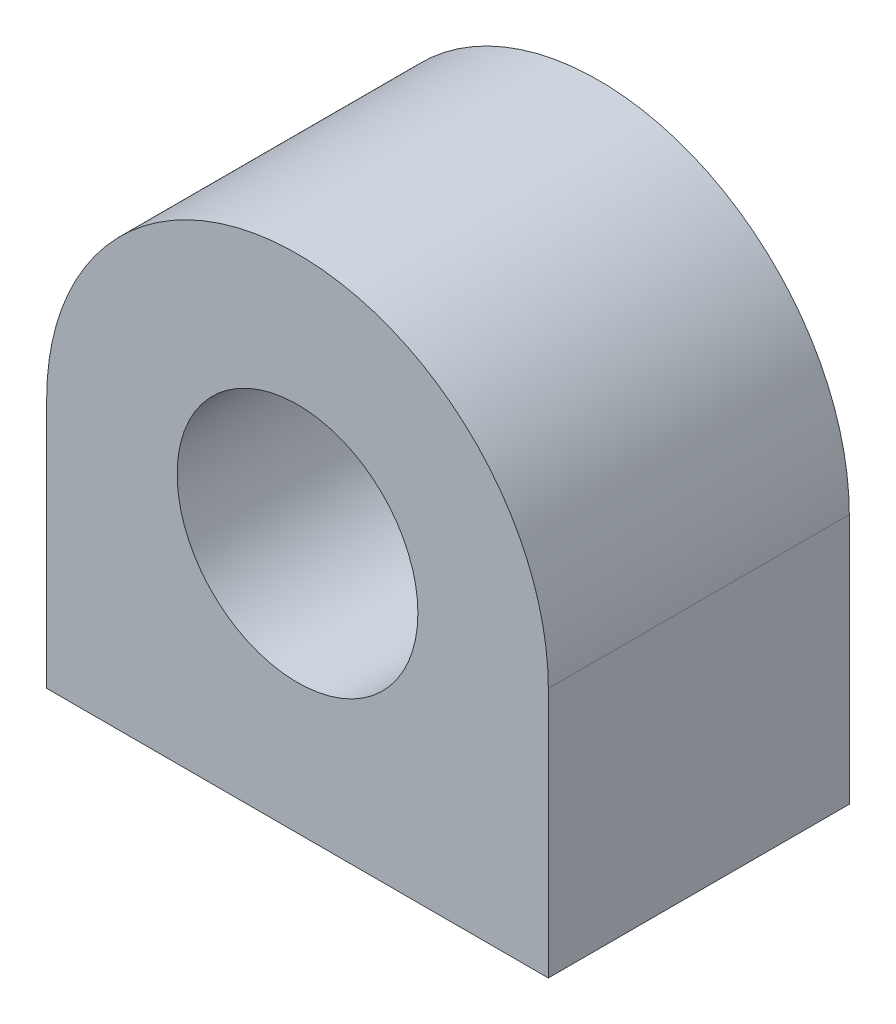
ISO-10303-21;
HEADER;
FILE_DESCRIPTION(('STEP AP214'),'2;1');
FILE_NAME('part.step','',(''),(''),'','','');
FILE_SCHEMA(('AUTOMOTIVE_DESIGN { 1 0 10303 214 1 1 1 1 }'));
ENDSEC;
DATA;
#1=APPLICATION_CONTEXT('core data for automotive mechanical design processes');
#2=APPLICATION_PROTOCOL_DEFINITION('international standard','automotive_design',2000,#1);
#3=PRODUCT_CONTEXT('',#1,'mechanical');
#4=PRODUCT('Part','Part','',(#3));
#5=PRODUCT_RELATED_PRODUCT_CATEGORY('part','',(#4));
#6=PRODUCT_DEFINITION_FORMATION('','',#4);
#7=PRODUCT_DEFINITION_CONTEXT('part definition',#1,'design');
#8=PRODUCT_DEFINITION('design','',#6,#7);
#9=PRODUCT_DEFINITION_SHAPE('','',#8);
#10=(LENGTH_UNIT() NAMED_UNIT(*) SI_UNIT(.MILLI.,.METRE.));
#11=(NAMED_UNIT(*) PLANE_ANGLE_UNIT() SI_UNIT($,.RADIAN.));
#12=(NAMED_UNIT(*) SI_UNIT($,.STERADIAN.) SOLID_ANGLE_UNIT());
#13=UNCERTAINTY_MEASURE_WITH_UNIT(LENGTH_MEASURE(1.E-05),#10,'distance_accuracy_value','');
#14=(GEOMETRIC_REPRESENTATION_CONTEXT(3) GLOBAL_UNCERTAINTY_ASSIGNED_CONTEXT((#13)) GLOBAL_UNIT_ASSIGNED_CONTEXT((#10,
#11,#12)) REPRESENTATION_CONTEXT('',''));
#15=CARTESIAN_POINT('',(0.,0.,0.));
#16=DIRECTION('',(0.,0.,1.));
#17=DIRECTION('',(1.,0.,0.));
#18=AXIS2_PLACEMENT_3D('',#15,#16,#17);
#19=CARTESIAN_POINT('',(0.,0.,30.));
#20=DIRECTION('',(0.,0.,1.));
#21=DIRECTION('',(1.,0.,0.));
#22=AXIS2_PLACEMENT_3D('',#19,#20,#21);
#23=PLANE('',#22);
#24=CARTESIAN_POINT('',(0.,0.,30.));
#25=DIRECTION('',(0.,0.,1.));
#26=DIRECTION('',(1.,0.,0.));
#27=AXIS2_PLACEMENT_3D('',#24,#25,#26);
#28=CIRCLE('',#27,25.);
#29=CARTESIAN_POINT('',(25.,0.,30.));
#30=VERTEX_POINT('',#29);
#31=CARTESIAN_POINT('',(-25.,0.,30.));
#32=VERTEX_POINT('',#31);
#33=EDGE_CURVE('E92',#30,#32,#28,.T.);
#34=ORIENTED_EDGE('',*,*,#33,.T.);
#35=DIRECTION('',(0.,-1.,0.));
#36=VECTOR('',#35,1.);
#37=CARTESIAN_POINT('',(-25.,0.,30.));
#38=LINE('',#37,#36);
#39=CARTESIAN_POINT('',(-25.,-25.,30.));
#40=VERTEX_POINT('',#39);
#41=EDGE_CURVE('E87',#32,#40,#38,.T.);
#42=ORIENTED_EDGE('',*,*,#41,.T.);
#43=DIRECTION('',(1.,0.,0.));
#44=VECTOR('',#43,1.);
#45=CARTESIAN_POINT('',(-25.,-25.,30.));
#46=LINE('',#45,#44);
#47=CARTESIAN_POINT('',(25.,-25.,30.));
#48=VERTEX_POINT('',#47);
#49=EDGE_CURVE('E90',#40,#48,#46,.T.);
#50=ORIENTED_EDGE('',*,*,#49,.T.);
#51=DIRECTION('',(0.,1.,0.));
#52=VECTOR('',#51,1.);
#53=CARTESIAN_POINT('',(25.,0.,30.));
#54=LINE('',#53,#52);
#55=EDGE_CURVE('E57',#48,#30,#54,.T.);
#56=ORIENTED_EDGE('',*,*,#55,.T.);
#57=EDGE_LOOP('',(#34,#42,#50,#56));
#58=FACE_BOUND('',#57,.T.);
#59=CARTESIAN_POINT('',(0.,0.,30.));
#60=DIRECTION('',(0.,0.,1.));
#61=DIRECTION('',(1.,0.,0.));
#62=AXIS2_PLACEMENT_3D('',#59,#60,#61);
#63=CIRCLE('',#62,12.);
#64=CARTESIAN_POINT('',(12.,0.,30.));
#65=VERTEX_POINT('',#64);
#66=EDGE_CURVE('E112',#65,#65,#63,.T.);
#67=ORIENTED_EDGE('',*,*,#66,.F.);
#68=EDGE_LOOP('',(#67));
#69=FACE_BOUND('',#68,.T.);
#70=ADVANCED_FACE('F39',(#58,#69),#23,.T.);
#71=CARTESIAN_POINT('',(0.,0.,0.));
#72=DIRECTION('',(0.,0.,1.));
#73=DIRECTION('',(1.,0.,0.));
#74=AXIS2_PLACEMENT_3D('',#71,#72,#73);
#75=PLANE('',#74);
#76=CARTESIAN_POINT('',(0.,0.,0.));
#77=DIRECTION('',(0.,0.,1.));
#78=DIRECTION('',(1.,0.,0.));
#79=AXIS2_PLACEMENT_3D('',#76,#77,#78);
#80=CIRCLE('',#79,25.);
#81=CARTESIAN_POINT('',(25.,0.,0.));
#82=VERTEX_POINT('',#81);
#83=CARTESIAN_POINT('',(-25.,0.,0.));
#84=VERTEX_POINT('',#83);
#85=EDGE_CURVE('E108',#82,#84,#80,.T.);
#86=ORIENTED_EDGE('',*,*,#85,.F.);
#87=DIRECTION('',(0.,1.,0.));
#88=VECTOR('',#87,1.);
#89=CARTESIAN_POINT('',(25.,0.,0.));
#90=LINE('',#89,#88);
#91=CARTESIAN_POINT('',(25.,-25.,0.));
#92=VERTEX_POINT('',#91);
#93=EDGE_CURVE('E80',#92,#82,#90,.T.);
#94=ORIENTED_EDGE('',*,*,#93,.F.);
#95=DIRECTION('',(1.,0.,0.));
#96=VECTOR('',#95,1.);
#97=CARTESIAN_POINT('',(-25.,-25.,0.));
#98=LINE('',#97,#96);
#99=CARTESIAN_POINT('',(-25.,-25.,0.));
#100=VERTEX_POINT('',#99);
#101=EDGE_CURVE('E74',#100,#92,#98,.T.);
#102=ORIENTED_EDGE('',*,*,#101,.F.);
#103=DIRECTION('',(0.,-1.,0.));
#104=VECTOR('',#103,1.);
#105=CARTESIAN_POINT('',(-25.,0.,0.));
#106=LINE('',#105,#104);
#107=EDGE_CURVE('E97',#84,#100,#106,.T.);
#108=ORIENTED_EDGE('',*,*,#107,.F.);
#109=EDGE_LOOP('',(#86,#94,#102,#108));
#110=FACE_BOUND('',#109,.T.);
#111=CARTESIAN_POINT('',(0.,0.,0.));
#112=DIRECTION('',(0.,0.,1.));
#113=DIRECTION('',(1.,0.,0.));
#114=AXIS2_PLACEMENT_3D('',#111,#112,#113);
#115=CIRCLE('',#114,12.);
#116=CARTESIAN_POINT('',(12.,0.,0.));
#117=VERTEX_POINT('',#116);
#118=EDGE_CURVE('E130',#117,#117,#115,.T.);
#119=ORIENTED_EDGE('',*,*,#118,.T.);
#120=EDGE_LOOP('',(#119));
#121=FACE_BOUND('',#120,.T.);
#122=ADVANCED_FACE('F125',(#110,#121),#75,.F.);
#123=CARTESIAN_POINT('',(0.,0.,30.));
#124=DIRECTION('',(0.,0.,-1.));
#125=DIRECTION('',(-1.,0.,0.));
#126=AXIS2_PLACEMENT_3D('',#123,#124,#125);
#127=CYLINDRICAL_SURFACE('',#126,25.);
#128=ORIENTED_EDGE('',*,*,#85,.T.);
#129=DIRECTION('',(0.,0.,-1.));
#130=VECTOR('',#129,1.);
#131=CARTESIAN_POINT('',(-25.,0.,30.));
#132=LINE('',#131,#130);
#133=EDGE_CURVE('E11',#32,#84,#132,.T.);
#134=ORIENTED_EDGE('',*,*,#133,.F.);
#135=ORIENTED_EDGE('',*,*,#33,.F.);
#136=DIRECTION('',(0.,0.,-1.));
#137=VECTOR('',#136,1.);
#138=CARTESIAN_POINT('',(25.,0.,30.));
#139=LINE('',#138,#137);
#140=EDGE_CURVE('E104',#30,#82,#139,.T.);
#141=ORIENTED_EDGE('',*,*,#140,.T.);
#142=EDGE_LOOP('',(#128,#134,#135,#141));
#143=FACE_BOUND('',#142,.T.);
#144=ADVANCED_FACE('F41',(#143),#127,.T.);
#145=CARTESIAN_POINT('',(-25.,0.,30.));
#146=DIRECTION('',(1.,0.,0.));
#147=DIRECTION('',(0.,0.,-1.));
#148=AXIS2_PLACEMENT_3D('',#145,#146,#147);
#149=PLANE('',#148);
#150=ORIENTED_EDGE('',*,*,#107,.T.);
#151=DIRECTION('',(0.,0.,-1.));
#152=VECTOR('',#151,1.);
#153=CARTESIAN_POINT('',(-25.,-25.,30.));
#154=LINE('',#153,#152);
#155=EDGE_CURVE('E49',#40,#100,#154,.T.);
#156=ORIENTED_EDGE('',*,*,#155,.F.);
#157=ORIENTED_EDGE('',*,*,#41,.F.);
#158=ORIENTED_EDGE('',*,*,#133,.T.);
#159=EDGE_LOOP('',(#150,#156,#157,#158));
#160=FACE_BOUND('',#159,.T.);
#161=ADVANCED_FACE('F96',(#160),#149,.F.);
#162=CARTESIAN_POINT('',(-25.,-25.,30.));
#163=DIRECTION('',(0.,1.,0.));
#164=DIRECTION('',(0.,0.,1.));
#165=AXIS2_PLACEMENT_3D('',#162,#163,#164);
#166=PLANE('',#165);
#167=ORIENTED_EDGE('',*,*,#101,.T.);
#168=DIRECTION('',(0.,0.,-1.));
#169=VECTOR('',#168,1.);
#170=CARTESIAN_POINT('',(25.,-25.,30.));
#171=LINE('',#170,#169);
#172=EDGE_CURVE('E99',#48,#92,#171,.T.);
#173=ORIENTED_EDGE('',*,*,#172,.F.);
#174=ORIENTED_EDGE('',*,*,#49,.F.);
#175=ORIENTED_EDGE('',*,*,#155,.T.);
#176=EDGE_LOOP('',(#167,#173,#174,#175));
#177=FACE_BOUND('',#176,.T.);
#178=ADVANCED_FACE('F100',(#177),#166,.F.);
#179=CARTESIAN_POINT('',(25.,0.,30.));
#180=DIRECTION('',(-1.,0.,0.));
#181=DIRECTION('',(0.,0.,1.));
#182=AXIS2_PLACEMENT_3D('',#179,#180,#181);
#183=PLANE('',#182);
#184=ORIENTED_EDGE('',*,*,#93,.T.);
#185=ORIENTED_EDGE('',*,*,#140,.F.);
#186=ORIENTED_EDGE('',*,*,#55,.F.);
#187=ORIENTED_EDGE('',*,*,#172,.T.);
#188=EDGE_LOOP('',(#184,#185,#186,#187));
#189=FACE_BOUND('',#188,.T.);
#190=ADVANCED_FACE('F122',(#189),#183,.F.);
#191=CARTESIAN_POINT('',(0.,0.,30.));
#192=DIRECTION('',(0.,0.,-1.));
#193=DIRECTION('',(-1.,0.,0.));
#194=AXIS2_PLACEMENT_3D('',#191,#192,#193);
#195=CYLINDRICAL_SURFACE('',#194,12.);
#196=ORIENTED_EDGE('',*,*,#66,.T.);
#197=EDGE_LOOP('',(#196));
#198=FACE_BOUND('',#197,.T.);
#199=ORIENTED_EDGE('',*,*,#118,.F.);
#200=EDGE_LOOP('',(#199));
#201=FACE_BOUND('',#200,.T.);
#202=ADVANCED_FACE('F138',(#198,#201),#195,.F.);
#203=CLOSED_SHELL('',(#70,#122,#144,#161,#178,#190,#202));
#204=MANIFOLD_SOLID_BREP('B2',#203);
#205=ADVANCED_BREP_SHAPE_REPRESENTATION('',(#18,#204),#14);
#206=SHAPE_DEFINITION_REPRESENTATION(#9,#205);
ENDSEC;
END-ISO-10303-21;
